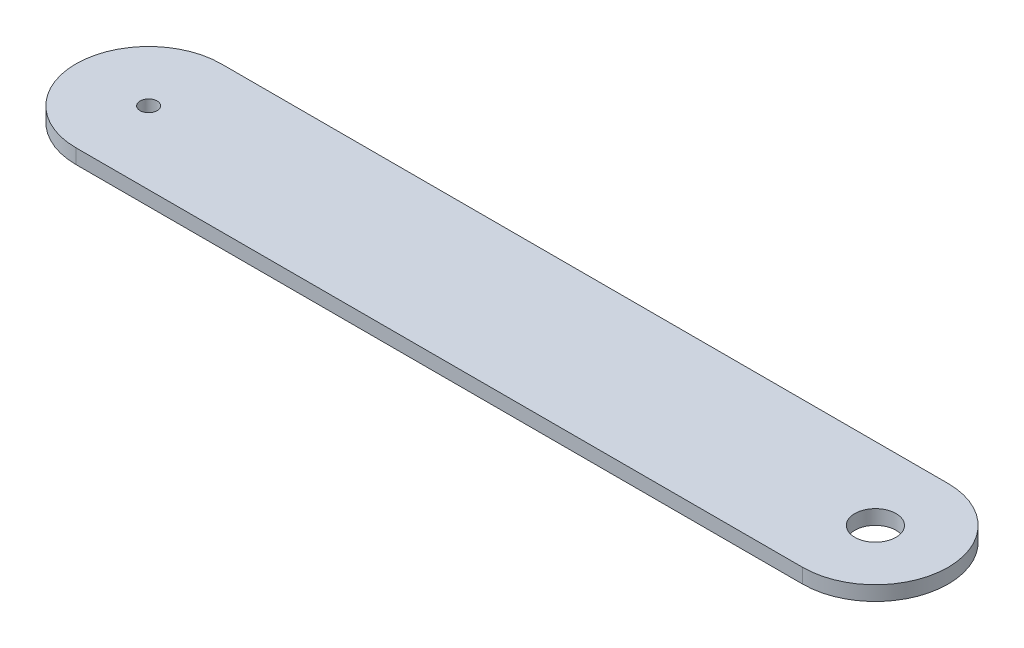
ISO-10303-21;
HEADER;
FILE_DESCRIPTION(('STEP AP214'),'2;1');
FILE_NAME('part.step','',(''),(''),'','','');
FILE_SCHEMA(('AUTOMOTIVE_DESIGN { 1 0 10303 214 1 1 1 1 }'));
ENDSEC;
DATA;
#1=APPLICATION_CONTEXT('core data for automotive mechanical design processes');
#2=APPLICATION_PROTOCOL_DEFINITION('international standard','automotive_design',2000,#1);
#3=PRODUCT_CONTEXT('',#1,'mechanical');
#4=PRODUCT('Part','Part','',(#3));
#5=PRODUCT_RELATED_PRODUCT_CATEGORY('part','',(#4));
#6=PRODUCT_DEFINITION_FORMATION('','',#4);
#7=PRODUCT_DEFINITION_CONTEXT('part definition',#1,'design');
#8=PRODUCT_DEFINITION('design','',#6,#7);
#9=PRODUCT_DEFINITION_SHAPE('','',#8);
#10=(LENGTH_UNIT() NAMED_UNIT(*) SI_UNIT(.MILLI.,.METRE.));
#11=(NAMED_UNIT(*) PLANE_ANGLE_UNIT() SI_UNIT($,.RADIAN.));
#12=(NAMED_UNIT(*) SI_UNIT($,.STERADIAN.) SOLID_ANGLE_UNIT());
#13=UNCERTAINTY_MEASURE_WITH_UNIT(LENGTH_MEASURE(1.E-05),#10,'distance_accuracy_value','');
#14=(GEOMETRIC_REPRESENTATION_CONTEXT(3) GLOBAL_UNCERTAINTY_ASSIGNED_CONTEXT((#13)) GLOBAL_UNIT_ASSIGNED_CONTEXT((#10,
#11,#12)) REPRESENTATION_CONTEXT('',''));
#15=CARTESIAN_POINT('',(0.,0.,0.));
#16=DIRECTION('',(0.,0.,1.));
#17=DIRECTION('',(1.,0.,0.));
#18=AXIS2_PLACEMENT_3D('',#15,#16,#17);
#19=CARTESIAN_POINT('',(100.,3.,0.));
#20=DIRECTION('',(0.,-1.,0.));
#21=DIRECTION('',(0.,0.,-1.));
#22=AXIS2_PLACEMENT_3D('',#19,#20,#21);
#23=CYLINDRICAL_SURFACE('',#22,15.);
#24=CARTESIAN_POINT('',(100.,0.,0.));
#25=DIRECTION('',(0.,1.,0.));
#26=DIRECTION('',(0.,0.,-1.));
#27=AXIS2_PLACEMENT_3D('',#24,#25,#26);
#28=CIRCLE('',#27,15.);
#29=CARTESIAN_POINT('',(100.,0.,15.));
#30=VERTEX_POINT('',#29);
#31=CARTESIAN_POINT('',(100.,0.,-15.));
#32=VERTEX_POINT('',#31);
#33=EDGE_CURVE('E114',#30,#32,#28,.T.);
#34=ORIENTED_EDGE('',*,*,#33,.T.);
#35=DIRECTION('',(0.,-1.,0.));
#36=VECTOR('',#35,1.);
#37=CARTESIAN_POINT('',(100.,3.,-15.));
#38=LINE('',#37,#36);
#39=CARTESIAN_POINT('',(100.,3.,-15.));
#40=VERTEX_POINT('',#39);
#41=EDGE_CURVE('E11',#40,#32,#38,.T.);
#42=ORIENTED_EDGE('',*,*,#41,.F.);
#43=CARTESIAN_POINT('',(100.,3.,0.));
#44=DIRECTION('',(0.,1.,0.));
#45=DIRECTION('',(0.,0.,-1.));
#46=AXIS2_PLACEMENT_3D('',#43,#44,#45);
#47=CIRCLE('',#46,15.);
#48=CARTESIAN_POINT('',(100.,3.,15.));
#49=VERTEX_POINT('',#48);
#50=EDGE_CURVE('E97',#49,#40,#47,.T.);
#51=ORIENTED_EDGE('',*,*,#50,.F.);
#52=DIRECTION('',(0.,-1.,0.));
#53=VECTOR('',#52,1.);
#54=CARTESIAN_POINT('',(100.,3.,15.));
#55=LINE('',#54,#53);
#56=EDGE_CURVE('E110',#49,#30,#55,.T.);
#57=ORIENTED_EDGE('',*,*,#56,.T.);
#58=EDGE_LOOP('',(#34,#42,#51,#57));
#59=FACE_BOUND('',#58,.T.);
#60=ADVANCED_FACE('F43',(#59),#23,.T.);
#61=CARTESIAN_POINT('',(-50.,3.,-15.));
#62=DIRECTION('',(0.,0.,1.));
#63=DIRECTION('',(1.,0.,0.));
#64=AXIS2_PLACEMENT_3D('',#61,#62,#63);
#65=PLANE('',#64);
#66=DIRECTION('',(-1.,0.,0.));
#67=VECTOR('',#66,1.);
#68=CARTESIAN_POINT('',(-50.,0.,-15.));
#69=LINE('',#68,#67);
#70=CARTESIAN_POINT('',(-50.,0.,-15.));
#71=VERTEX_POINT('',#70);
#72=EDGE_CURVE('E102',#32,#71,#69,.T.);
#73=ORIENTED_EDGE('',*,*,#72,.T.);
#74=DIRECTION('',(0.,-1.,0.));
#75=VECTOR('',#74,1.);
#76=CARTESIAN_POINT('',(-50.,3.,-15.));
#77=LINE('',#76,#75);
#78=CARTESIAN_POINT('',(-50.,3.,-15.));
#79=VERTEX_POINT('',#78);
#80=EDGE_CURVE('E53',#79,#71,#77,.T.);
#81=ORIENTED_EDGE('',*,*,#80,.F.);
#82=DIRECTION('',(-1.,0.,0.));
#83=VECTOR('',#82,1.);
#84=CARTESIAN_POINT('',(-50.,3.,-15.));
#85=LINE('',#84,#83);
#86=EDGE_CURVE('E92',#40,#79,#85,.T.);
#87=ORIENTED_EDGE('',*,*,#86,.F.);
#88=ORIENTED_EDGE('',*,*,#41,.T.);
#89=EDGE_LOOP('',(#73,#81,#87,#88));
#90=FACE_BOUND('',#89,.T.);
#91=ADVANCED_FACE('F101',(#90),#65,.F.);
#92=CARTESIAN_POINT('',(-50.,3.,0.));
#93=DIRECTION('',(0.,-1.,0.));
#94=DIRECTION('',(0.,0.,-1.));
#95=AXIS2_PLACEMENT_3D('',#92,#93,#94);
#96=CYLINDRICAL_SURFACE('',#95,15.);
#97=CARTESIAN_POINT('',(-50.,0.,0.));
#98=DIRECTION('',(0.,1.,0.));
#99=DIRECTION('',(0.,0.,1.));
#100=AXIS2_PLACEMENT_3D('',#97,#98,#99);
#101=CIRCLE('',#100,15.);
#102=CARTESIAN_POINT('',(-50.,0.,15.));
#103=VERTEX_POINT('',#102);
#104=EDGE_CURVE('E79',#71,#103,#101,.T.);
#105=ORIENTED_EDGE('',*,*,#104,.T.);
#106=DIRECTION('',(0.,-1.,0.));
#107=VECTOR('',#106,1.);
#108=CARTESIAN_POINT('',(-50.,3.,15.));
#109=LINE('',#108,#107);
#110=CARTESIAN_POINT('',(-50.,3.,15.));
#111=VERTEX_POINT('',#110);
#112=EDGE_CURVE('E104',#111,#103,#109,.T.);
#113=ORIENTED_EDGE('',*,*,#112,.F.);
#114=CARTESIAN_POINT('',(-50.,3.,0.));
#115=DIRECTION('',(0.,1.,0.));
#116=DIRECTION('',(0.,0.,1.));
#117=AXIS2_PLACEMENT_3D('',#114,#115,#116);
#118=CIRCLE('',#117,15.);
#119=EDGE_CURVE('E95',#79,#111,#118,.T.);
#120=ORIENTED_EDGE('',*,*,#119,.F.);
#121=ORIENTED_EDGE('',*,*,#80,.T.);
#122=EDGE_LOOP('',(#105,#113,#120,#121));
#123=FACE_BOUND('',#122,.T.);
#124=ADVANCED_FACE('F106',(#123),#96,.T.);
#125=CARTESIAN_POINT('',(-50.,3.,15.));
#126=DIRECTION('',(0.,0.,-1.));
#127=DIRECTION('',(-1.,0.,0.));
#128=AXIS2_PLACEMENT_3D('',#125,#126,#127);
#129=PLANE('',#128);
#130=DIRECTION('',(1.,0.,0.));
#131=VECTOR('',#130,1.);
#132=CARTESIAN_POINT('',(-50.,0.,15.));
#133=LINE('',#132,#131);
#134=EDGE_CURVE('E85',#103,#30,#133,.T.);
#135=ORIENTED_EDGE('',*,*,#134,.T.);
#136=ORIENTED_EDGE('',*,*,#56,.F.);
#137=DIRECTION('',(1.,0.,0.));
#138=VECTOR('',#137,1.);
#139=CARTESIAN_POINT('',(-50.,3.,15.));
#140=LINE('',#139,#138);
#141=EDGE_CURVE('E62',#111,#49,#140,.T.);
#142=ORIENTED_EDGE('',*,*,#141,.F.);
#143=ORIENTED_EDGE('',*,*,#112,.T.);
#144=EDGE_LOOP('',(#135,#136,#142,#143));
#145=FACE_BOUND('',#144,.T.);
#146=ADVANCED_FACE('F151',(#145),#129,.F.);
#147=CARTESIAN_POINT('',(100.,3.,0.));
#148=DIRECTION('',(0.,-1.,0.));
#149=DIRECTION('',(0.,0.,-1.));
#150=AXIS2_PLACEMENT_3D('',#147,#148,#149);
#151=PLANE('',#150);
#152=CARTESIAN_POINT('',(-50.,3.,0.));
#153=DIRECTION('',(0.,1.,0.));
#154=DIRECTION('',(0.,0.,1.));
#155=AXIS2_PLACEMENT_3D('',#152,#153,#154);
#156=CIRCLE('',#155,1.75);
#157=CARTESIAN_POINT('',(-50.,3.,1.75));
#158=VERTEX_POINT('',#157);
#159=EDGE_CURVE('E130',#158,#158,#156,.T.);
#160=ORIENTED_EDGE('',*,*,#159,.F.);
#161=EDGE_LOOP('',(#160));
#162=FACE_BOUND('',#161,.T.);
#163=CARTESIAN_POINT('',(100.,3.,0.));
#164=DIRECTION('',(0.,1.,0.));
#165=DIRECTION('',(0.,0.,-1.));
#166=AXIS2_PLACEMENT_3D('',#163,#164,#165);
#167=CIRCLE('',#166,4.25000000000001);
#168=CARTESIAN_POINT('',(100.,3.,-4.25000000000001));
#169=VERTEX_POINT('',#168);
#170=EDGE_CURVE('E137',#169,#169,#167,.T.);
#171=ORIENTED_EDGE('',*,*,#170,.F.);
#172=EDGE_LOOP('',(#171));
#173=FACE_BOUND('',#172,.T.);
#174=ORIENTED_EDGE('',*,*,#50,.T.);
#175=ORIENTED_EDGE('',*,*,#86,.T.);
#176=ORIENTED_EDGE('',*,*,#119,.T.);
#177=ORIENTED_EDGE('',*,*,#141,.T.);
#178=EDGE_LOOP('',(#174,#175,#176,#177));
#179=FACE_BOUND('',#178,.T.);
#180=ADVANCED_FACE('F93',(#162,#173,#179),#151,.F.);
#181=CARTESIAN_POINT('',(100.,0.,0.));
#182=DIRECTION('',(0.,-1.,0.));
#183=DIRECTION('',(0.,0.,-1.));
#184=AXIS2_PLACEMENT_3D('',#181,#182,#183);
#185=PLANE('',#184);
#186=CARTESIAN_POINT('',(-50.,0.,0.));
#187=DIRECTION('',(0.,-1.,0.));
#188=DIRECTION('',(0.,0.,-1.));
#189=AXIS2_PLACEMENT_3D('',#186,#187,#188);
#190=CIRCLE('',#189,1.75);
#191=CARTESIAN_POINT('',(-50.,0.,-1.75));
#192=VERTEX_POINT('',#191);
#193=EDGE_CURVE('E46',#192,#192,#190,.T.);
#194=ORIENTED_EDGE('',*,*,#193,.F.);
#195=EDGE_LOOP('',(#194));
#196=FACE_BOUND('',#195,.T.);
#197=CARTESIAN_POINT('',(100.,0.,0.));
#198=DIRECTION('',(0.,-1.,0.));
#199=DIRECTION('',(0.,0.,-1.));
#200=AXIS2_PLACEMENT_3D('',#197,#198,#199);
#201=CIRCLE('',#200,4.25000000000001);
#202=CARTESIAN_POINT('',(100.,0.,-4.25000000000001));
#203=VERTEX_POINT('',#202);
#204=EDGE_CURVE('E127',#203,#203,#201,.T.);
#205=ORIENTED_EDGE('',*,*,#204,.F.);
#206=EDGE_LOOP('',(#205));
#207=FACE_BOUND('',#206,.T.);
#208=ORIENTED_EDGE('',*,*,#33,.F.);
#209=ORIENTED_EDGE('',*,*,#134,.F.);
#210=ORIENTED_EDGE('',*,*,#104,.F.);
#211=ORIENTED_EDGE('',*,*,#72,.F.);
#212=EDGE_LOOP('',(#208,#209,#210,#211));
#213=FACE_BOUND('',#212,.T.);
#214=ADVANCED_FACE('F150',(#196,#207,#213),#185,.T.);
#215=CARTESIAN_POINT('',(100.,-7.,0.));
#216=DIRECTION('',(0.,1.,0.));
#217=DIRECTION('',(0.,0.,1.));
#218=AXIS2_PLACEMENT_3D('',#215,#216,#217);
#219=CYLINDRICAL_SURFACE('',#218,4.25000000000001);
#220=ORIENTED_EDGE('',*,*,#204,.T.);
#221=EDGE_LOOP('',(#220));
#222=FACE_BOUND('',#221,.T.);
#223=ORIENTED_EDGE('',*,*,#170,.T.);
#224=EDGE_LOOP('',(#223));
#225=FACE_BOUND('',#224,.T.);
#226=ADVANCED_FACE('F147',(#222,#225),#219,.F.);
#227=CARTESIAN_POINT('',(-50.,-7.,0.));
#228=DIRECTION('',(0.,1.,0.));
#229=DIRECTION('',(0.,0.,1.));
#230=AXIS2_PLACEMENT_3D('',#227,#228,#229);
#231=CYLINDRICAL_SURFACE('',#230,1.75);
#232=ORIENTED_EDGE('',*,*,#193,.T.);
#233=EDGE_LOOP('',(#232));
#234=FACE_BOUND('',#233,.T.);
#235=ORIENTED_EDGE('',*,*,#159,.T.);
#236=EDGE_LOOP('',(#235));
#237=FACE_BOUND('',#236,.T.);
#238=ADVANCED_FACE('F201',(#234,#237),#231,.F.);
#239=CLOSED_SHELL('',(#60,#91,#124,#146,#180,#214,#226,#238));
#240=MANIFOLD_SOLID_BREP('B2',#239);
#241=ADVANCED_BREP_SHAPE_REPRESENTATION('',(#18,#240),#14);
#242=SHAPE_DEFINITION_REPRESENTATION(#9,#241);
ENDSEC;
END-ISO-10303-21;
